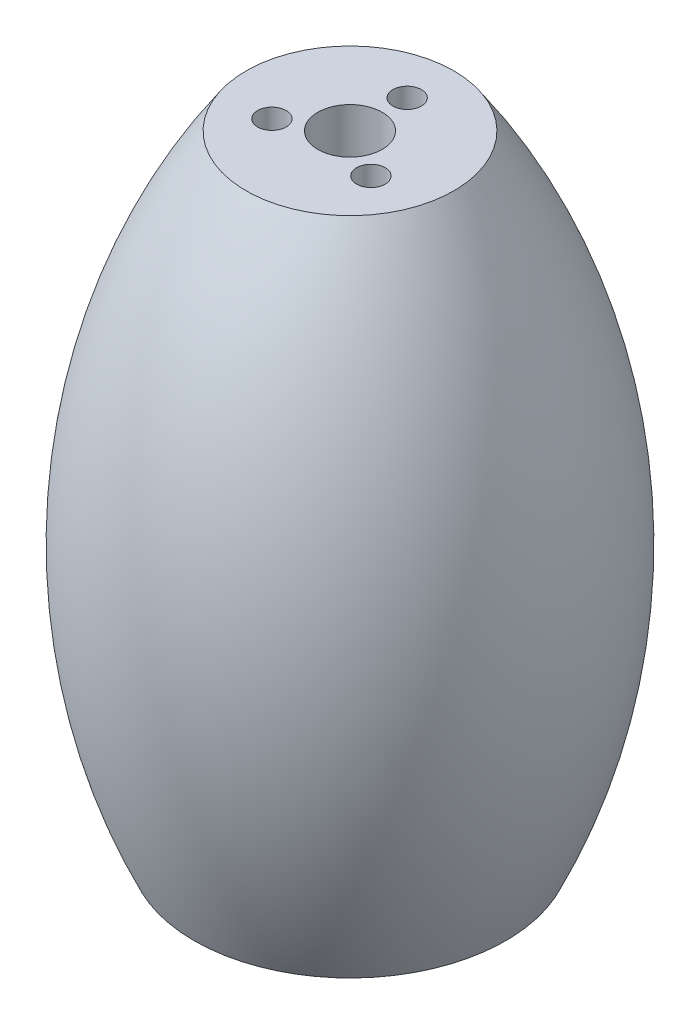
ISO-10303-21;
HEADER;
FILE_DESCRIPTION(('STEP AP214'),'2;1');
FILE_NAME('part.step','',(''),(''),'','','');
FILE_SCHEMA(('AUTOMOTIVE_DESIGN { 1 0 10303 214 1 1 1 1 }'));
ENDSEC;
DATA;
#1=APPLICATION_CONTEXT('core data for automotive mechanical design processes');
#2=APPLICATION_PROTOCOL_DEFINITION('international standard','automotive_design',2000,#1);
#3=PRODUCT_CONTEXT('',#1,'mechanical');
#4=PRODUCT('Part','Part','',(#3));
#5=PRODUCT_RELATED_PRODUCT_CATEGORY('part','',(#4));
#6=PRODUCT_DEFINITION_FORMATION('','',#4);
#7=PRODUCT_DEFINITION_CONTEXT('part definition',#1,'design');
#8=PRODUCT_DEFINITION('design','',#6,#7);
#9=PRODUCT_DEFINITION_SHAPE('','',#8);
#10=(LENGTH_UNIT() NAMED_UNIT(*) SI_UNIT(.MILLI.,.METRE.));
#11=(NAMED_UNIT(*) PLANE_ANGLE_UNIT() SI_UNIT($,.RADIAN.));
#12=(NAMED_UNIT(*) SI_UNIT($,.STERADIAN.) SOLID_ANGLE_UNIT());
#13=UNCERTAINTY_MEASURE_WITH_UNIT(LENGTH_MEASURE(1.E-05),#10,'distance_accuracy_value','');
#14=(GEOMETRIC_REPRESENTATION_CONTEXT(3) GLOBAL_UNCERTAINTY_ASSIGNED_CONTEXT((#13)) GLOBAL_UNIT_ASSIGNED_CONTEXT((#10,
#11,#12)) REPRESENTATION_CONTEXT('',''));
#15=CARTESIAN_POINT('',(0.,0.,0.));
#16=DIRECTION('',(0.,0.,1.));
#17=DIRECTION('',(1.,0.,0.));
#18=AXIS2_PLACEMENT_3D('',#15,#16,#17);
#19=CARTESIAN_POINT('',(0.,51.25,0.));
#20=DIRECTION('',(0.,-1.,0.));
#21=DIRECTION('',(0.,0.,-1.));
#22=AXIS2_PLACEMENT_3D('',#19,#20,#21);
#23=DEGENERATE_TOROIDAL_SURFACE('',#22,80.,121.353048993422,.F.);
#24=CARTESIAN_POINT('',(0.,0.,0.));
#25=DIRECTION('',(0.,-1.,0.));
#26=DIRECTION('',(0.,0.,-1.));
#27=AXIS2_PLACEMENT_3D('',#24,#25,#26);
#28=CIRCLE('',#27,30.);
#29=CARTESIAN_POINT('',(0.,0.,-30.));
#30=VERTEX_POINT('',#29);
#31=EDGE_CURVE('E44',#30,#30,#28,.T.);
#32=ORIENTED_EDGE('',*,*,#31,.F.);
#33=EDGE_LOOP('',(#32));
#34=FACE_BOUND('',#33,.T.);
#35=CARTESIAN_POINT('',(0.,120.,0.));
#36=DIRECTION('',(0.,-1.,0.));
#37=DIRECTION('',(0.,0.,-1.));
#38=AXIS2_PLACEMENT_3D('',#35,#36,#37);
#39=CIRCLE('',#38,20.);
#40=CARTESIAN_POINT('',(0.,120.,-20.));
#41=VERTEX_POINT('',#40);
#42=EDGE_CURVE('E10',#41,#41,#39,.T.);
#43=ORIENTED_EDGE('',*,*,#42,.T.);
#44=EDGE_LOOP('',(#43));
#45=FACE_BOUND('',#44,.T.);
#46=ADVANCED_FACE('F37',(#34,#45),#23,.F.);
#47=CARTESIAN_POINT('',(0.,120.,0.));
#48=DIRECTION('',(0.,-1.,0.));
#49=DIRECTION('',(0.,0.,-1.));
#50=AXIS2_PLACEMENT_3D('',#47,#48,#49);
#51=PLANE('',#50);
#52=CARTESIAN_POINT('',(0.,120.,0.));
#53=DIRECTION('',(0.,1.,0.));
#54=DIRECTION('',(0.,0.,1.));
#55=AXIS2_PLACEMENT_3D('',#52,#53,#54);
#56=CIRCLE('',#55,6.2);
#57=CARTESIAN_POINT('',(0.,120.,6.2));
#58=VERTEX_POINT('',#57);
#59=EDGE_CURVE('E101',#58,#58,#56,.T.);
#60=ORIENTED_EDGE('',*,*,#59,.F.);
#61=EDGE_LOOP('',(#60));
#62=FACE_BOUND('',#61,.T.);
#63=CARTESIAN_POINT('',(0.,120.,-11.));
#64=DIRECTION('',(0.,1.,0.));
#65=DIRECTION('',(0.,0.,1.));
#66=AXIS2_PLACEMENT_3D('',#63,#64,#65);
#67=CIRCLE('',#66,2.75);
#68=CARTESIAN_POINT('',(0.,120.,-8.25));
#69=VERTEX_POINT('',#68);
#70=EDGE_CURVE('E54',#69,#69,#67,.T.);
#71=ORIENTED_EDGE('',*,*,#70,.F.);
#72=EDGE_LOOP('',(#71));
#73=FACE_BOUND('',#72,.T.);
#74=CARTESIAN_POINT('',(9.52627944162882,120.,5.5));
#75=DIRECTION('',(0.,1.,0.));
#76=DIRECTION('',(0.,0.,1.));
#77=AXIS2_PLACEMENT_3D('',#74,#75,#76);
#78=CIRCLE('',#77,2.75000000000005);
#79=CARTESIAN_POINT('',(9.52627944162882,120.,8.25000000000005));
#80=VERTEX_POINT('',#79);
#81=EDGE_CURVE('E66',#80,#80,#78,.T.);
#82=ORIENTED_EDGE('',*,*,#81,.F.);
#83=EDGE_LOOP('',(#82));
#84=FACE_BOUND('',#83,.T.);
#85=CARTESIAN_POINT('',(-9.52627944162883,120.,5.5));
#86=DIRECTION('',(0.,1.,0.));
#87=DIRECTION('',(0.,0.,1.));
#88=AXIS2_PLACEMENT_3D('',#85,#86,#87);
#89=CIRCLE('',#88,2.7500000000001);
#90=CARTESIAN_POINT('',(-9.52627944162883,120.,8.2500000000001));
#91=VERTEX_POINT('',#90);
#92=EDGE_CURVE('E57',#91,#91,#89,.T.);
#93=ORIENTED_EDGE('',*,*,#92,.F.);
#94=EDGE_LOOP('',(#93));
#95=FACE_BOUND('',#94,.T.);
#96=ORIENTED_EDGE('',*,*,#42,.F.);
#97=EDGE_LOOP('',(#96));
#98=FACE_BOUND('',#97,.T.);
#99=ADVANCED_FACE('F119',(#62,#73,#84,#95,#98),#51,.F.);
#100=CARTESIAN_POINT('',(-30.,0.,0.));
#101=DIRECTION('',(0.,1.,0.));
#102=DIRECTION('',(0.,0.,1.));
#103=AXIS2_PLACEMENT_3D('',#100,#101,#102);
#104=PLANE('',#103);
#105=CARTESIAN_POINT('',(0.,0.,0.));
#106=DIRECTION('',(0.,1.,0.));
#107=DIRECTION('',(0.,0.,1.));
#108=AXIS2_PLACEMENT_3D('',#105,#106,#107);
#109=CIRCLE('',#108,6.2);
#110=CARTESIAN_POINT('',(0.,0.,6.2));
#111=VERTEX_POINT('',#110);
#112=EDGE_CURVE('E82',#111,#111,#109,.T.);
#113=ORIENTED_EDGE('',*,*,#112,.T.);
#114=EDGE_LOOP('',(#113));
#115=FACE_BOUND('',#114,.T.);
#116=CARTESIAN_POINT('',(0.,0.,-11.));
#117=DIRECTION('',(0.,1.,0.));
#118=DIRECTION('',(0.,0.,1.));
#119=AXIS2_PLACEMENT_3D('',#116,#117,#118);
#120=CIRCLE('',#119,2.75);
#121=CARTESIAN_POINT('',(0.,0.,-8.25));
#122=VERTEX_POINT('',#121);
#123=EDGE_CURVE('E94',#122,#122,#120,.T.);
#124=ORIENTED_EDGE('',*,*,#123,.T.);
#125=EDGE_LOOP('',(#124));
#126=FACE_BOUND('',#125,.T.);
#127=CARTESIAN_POINT('',(9.52627944162882,0.,5.5));
#128=DIRECTION('',(0.,1.,0.));
#129=DIRECTION('',(0.,0.,1.));
#130=AXIS2_PLACEMENT_3D('',#127,#128,#129);
#131=CIRCLE('',#130,2.75000000000005);
#132=CARTESIAN_POINT('',(9.52627944162882,0.,8.25000000000005));
#133=VERTEX_POINT('',#132);
#134=EDGE_CURVE('E86',#133,#133,#131,.T.);
#135=ORIENTED_EDGE('',*,*,#134,.T.);
#136=EDGE_LOOP('',(#135));
#137=FACE_BOUND('',#136,.T.);
#138=CARTESIAN_POINT('',(-9.52627944162883,0.,5.5));
#139=DIRECTION('',(0.,1.,0.));
#140=DIRECTION('',(0.,0.,1.));
#141=AXIS2_PLACEMENT_3D('',#138,#139,#140);
#142=CIRCLE('',#141,2.7500000000001);
#143=CARTESIAN_POINT('',(-9.52627944162883,0.,8.2500000000001));
#144=VERTEX_POINT('',#143);
#145=EDGE_CURVE('E77',#144,#144,#142,.T.);
#146=ORIENTED_EDGE('',*,*,#145,.T.);
#147=EDGE_LOOP('',(#146));
#148=FACE_BOUND('',#147,.T.);
#149=ORIENTED_EDGE('',*,*,#31,.T.);
#150=EDGE_LOOP('',(#149));
#151=FACE_BOUND('',#150,.T.);
#152=ADVANCED_FACE('F109',(#115,#126,#137,#148,#151),#104,.F.);
#153=CARTESIAN_POINT('',(-9.52627944162883,115.,5.5));
#154=DIRECTION('',(0.,1.,0.));
#155=DIRECTION('',(0.,0.,1.));
#156=AXIS2_PLACEMENT_3D('',#153,#154,#155);
#157=CYLINDRICAL_SURFACE('',#156,2.7500000000001);
#158=CARTESIAN_POINT('',(-9.52627944162883,115.,5.5));
#159=DIRECTION('',(0.,1.,0.));
#160=DIRECTION('',(0.,0.,1.));
#161=AXIS2_PLACEMENT_3D('',#158,#159,#160);
#162=CIRCLE('',#161,2.7500000000001);
#163=CARTESIAN_POINT('',(-9.52627944162883,115.,8.2500000000001));
#164=VERTEX_POINT('',#163);
#165=EDGE_CURVE('E61',#164,#164,#162,.T.);
#166=ORIENTED_EDGE('',*,*,#165,.F.);
#167=EDGE_LOOP('',(#166));
#168=FACE_BOUND('',#167,.T.);
#169=ORIENTED_EDGE('',*,*,#92,.T.);
#170=EDGE_LOOP('',(#169));
#171=FACE_BOUND('',#170,.T.);
#172=ADVANCED_FACE('F129',(#168,#171),#157,.F.);
#173=CARTESIAN_POINT('',(-9.52627944162883,115.,5.5));
#174=DIRECTION('',(0.,1.,0.));
#175=DIRECTION('',(0.,0.,1.));
#176=AXIS2_PLACEMENT_3D('',#173,#174,#175);
#177=PLANE('',#176);
#178=ORIENTED_EDGE('',*,*,#165,.T.);
#179=EDGE_LOOP('',(#178));
#180=FACE_BOUND('',#179,.T.);
#181=ADVANCED_FACE('F131',(#180),#177,.T.);
#182=CARTESIAN_POINT('',(9.52627944162882,115.,5.5));
#183=DIRECTION('',(0.,1.,0.));
#184=DIRECTION('',(0.,0.,1.));
#185=AXIS2_PLACEMENT_3D('',#182,#183,#184);
#186=CYLINDRICAL_SURFACE('',#185,2.75000000000005);
#187=CARTESIAN_POINT('',(9.52627944162882,115.,5.5));
#188=DIRECTION('',(0.,1.,0.));
#189=DIRECTION('',(0.,0.,1.));
#190=AXIS2_PLACEMENT_3D('',#187,#188,#189);
#191=CIRCLE('',#190,2.75000000000005);
#192=CARTESIAN_POINT('',(9.52627944162882,115.,8.25000000000005));
#193=VERTEX_POINT('',#192);
#194=EDGE_CURVE('E70',#193,#193,#191,.T.);
#195=ORIENTED_EDGE('',*,*,#194,.F.);
#196=EDGE_LOOP('',(#195));
#197=FACE_BOUND('',#196,.T.);
#198=ORIENTED_EDGE('',*,*,#81,.T.);
#199=EDGE_LOOP('',(#198));
#200=FACE_BOUND('',#199,.T.);
#201=ADVANCED_FACE('F138',(#197,#200),#186,.F.);
#202=CARTESIAN_POINT('',(9.52627944162882,115.,5.5));
#203=DIRECTION('',(0.,1.,0.));
#204=DIRECTION('',(0.,0.,1.));
#205=AXIS2_PLACEMENT_3D('',#202,#203,#204);
#206=PLANE('',#205);
#207=ORIENTED_EDGE('',*,*,#194,.T.);
#208=EDGE_LOOP('',(#207));
#209=FACE_BOUND('',#208,.T.);
#210=ADVANCED_FACE('F226',(#209),#206,.T.);
#211=CARTESIAN_POINT('',(0.,115.,-11.));
#212=DIRECTION('',(0.,1.,0.));
#213=DIRECTION('',(0.,0.,1.));
#214=AXIS2_PLACEMENT_3D('',#211,#212,#213);
#215=CYLINDRICAL_SURFACE('',#214,2.75);
#216=CARTESIAN_POINT('',(0.,115.,-11.));
#217=DIRECTION('',(0.,1.,0.));
#218=DIRECTION('',(0.,0.,1.));
#219=AXIS2_PLACEMENT_3D('',#216,#217,#218);
#220=CIRCLE('',#219,2.75);
#221=CARTESIAN_POINT('',(0.,115.,-8.25));
#222=VERTEX_POINT('',#221);
#223=EDGE_CURVE('E49',#222,#222,#220,.T.);
#224=ORIENTED_EDGE('',*,*,#223,.F.);
#225=EDGE_LOOP('',(#224));
#226=FACE_BOUND('',#225,.T.);
#227=ORIENTED_EDGE('',*,*,#70,.T.);
#228=EDGE_LOOP('',(#227));
#229=FACE_BOUND('',#228,.T.);
#230=ADVANCED_FACE('F218',(#226,#229),#215,.F.);
#231=CARTESIAN_POINT('',(0.,115.,-11.));
#232=DIRECTION('',(0.,1.,0.));
#233=DIRECTION('',(0.,0.,1.));
#234=AXIS2_PLACEMENT_3D('',#231,#232,#233);
#235=PLANE('',#234);
#236=ORIENTED_EDGE('',*,*,#223,.T.);
#237=EDGE_LOOP('',(#236));
#238=FACE_BOUND('',#237,.T.);
#239=ADVANCED_FACE('F210',(#238),#235,.T.);
#240=CARTESIAN_POINT('',(-9.52627944162883,5.,5.5));
#241=DIRECTION('',(0.,-1.,0.));
#242=DIRECTION('',(0.,0.,-1.));
#243=AXIS2_PLACEMENT_3D('',#240,#241,#242);
#244=CYLINDRICAL_SURFACE('',#243,2.7500000000001);
#245=CARTESIAN_POINT('',(-9.52627944162883,5.,5.5));
#246=DIRECTION('',(0.,1.,0.));
#247=DIRECTION('',(0.,0.,1.));
#248=AXIS2_PLACEMENT_3D('',#245,#246,#247);
#249=CIRCLE('',#248,2.7500000000001);
#250=CARTESIAN_POINT('',(-9.52627944162883,5.,8.2500000000001));
#251=VERTEX_POINT('',#250);
#252=EDGE_CURVE('E81',#251,#251,#249,.T.);
#253=ORIENTED_EDGE('',*,*,#252,.T.);
#254=EDGE_LOOP('',(#253));
#255=FACE_BOUND('',#254,.T.);
#256=ORIENTED_EDGE('',*,*,#145,.F.);
#257=EDGE_LOOP('',(#256));
#258=FACE_BOUND('',#257,.T.);
#259=ADVANCED_FACE('F202',(#255,#258),#244,.F.);
#260=CARTESIAN_POINT('',(-9.52627944162883,5.,5.5));
#261=DIRECTION('',(0.,-1.,0.));
#262=DIRECTION('',(0.,0.,1.));
#263=AXIS2_PLACEMENT_3D('',#260,#261,#262);
#264=PLANE('',#263);
#265=ORIENTED_EDGE('',*,*,#252,.F.);
#266=EDGE_LOOP('',(#265));
#267=FACE_BOUND('',#266,.T.);
#268=ADVANCED_FACE('F194',(#267),#264,.T.);
#269=CARTESIAN_POINT('',(9.52627944162882,5.,5.5));
#270=DIRECTION('',(0.,-1.,0.));
#271=DIRECTION('',(0.,0.,-1.));
#272=AXIS2_PLACEMENT_3D('',#269,#270,#271);
#273=CYLINDRICAL_SURFACE('',#272,2.75000000000005);
#274=CARTESIAN_POINT('',(9.52627944162882,5.,5.5));
#275=DIRECTION('',(0.,1.,0.));
#276=DIRECTION('',(0.,0.,1.));
#277=AXIS2_PLACEMENT_3D('',#274,#275,#276);
#278=CIRCLE('',#277,2.75000000000005);
#279=CARTESIAN_POINT('',(9.52627944162882,5.,8.25000000000005));
#280=VERTEX_POINT('',#279);
#281=EDGE_CURVE('E90',#280,#280,#278,.T.);
#282=ORIENTED_EDGE('',*,*,#281,.T.);
#283=EDGE_LOOP('',(#282));
#284=FACE_BOUND('',#283,.T.);
#285=ORIENTED_EDGE('',*,*,#134,.F.);
#286=EDGE_LOOP('',(#285));
#287=FACE_BOUND('',#286,.T.);
#288=ADVANCED_FACE('F186',(#284,#287),#273,.F.);
#289=CARTESIAN_POINT('',(9.52627944162882,5.,5.5));
#290=DIRECTION('',(0.,-1.,0.));
#291=DIRECTION('',(0.,0.,1.));
#292=AXIS2_PLACEMENT_3D('',#289,#290,#291);
#293=PLANE('',#292);
#294=ORIENTED_EDGE('',*,*,#281,.F.);
#295=EDGE_LOOP('',(#294));
#296=FACE_BOUND('',#295,.T.);
#297=ADVANCED_FACE('F178',(#296),#293,.T.);
#298=CARTESIAN_POINT('',(0.,5.,-11.));
#299=DIRECTION('',(0.,-1.,0.));
#300=DIRECTION('',(0.,0.,-1.));
#301=AXIS2_PLACEMENT_3D('',#298,#299,#300);
#302=CYLINDRICAL_SURFACE('',#301,2.75);
#303=CARTESIAN_POINT('',(0.,5.,-11.));
#304=DIRECTION('',(0.,1.,0.));
#305=DIRECTION('',(0.,0.,1.));
#306=AXIS2_PLACEMENT_3D('',#303,#304,#305);
#307=CIRCLE('',#306,2.75);
#308=CARTESIAN_POINT('',(0.,5.,-8.25));
#309=VERTEX_POINT('',#308);
#310=EDGE_CURVE('E62',#309,#309,#307,.T.);
#311=ORIENTED_EDGE('',*,*,#310,.T.);
#312=EDGE_LOOP('',(#311));
#313=FACE_BOUND('',#312,.T.);
#314=ORIENTED_EDGE('',*,*,#123,.F.);
#315=EDGE_LOOP('',(#314));
#316=FACE_BOUND('',#315,.T.);
#317=ADVANCED_FACE('F171',(#313,#316),#302,.F.);
#318=CARTESIAN_POINT('',(0.,5.,-11.));
#319=DIRECTION('',(0.,-1.,0.));
#320=DIRECTION('',(0.,0.,1.));
#321=AXIS2_PLACEMENT_3D('',#318,#319,#320);
#322=PLANE('',#321);
#323=ORIENTED_EDGE('',*,*,#310,.F.);
#324=EDGE_LOOP('',(#323));
#325=FACE_BOUND('',#324,.T.);
#326=ADVANCED_FACE('F115',(#325),#322,.T.);
#327=CARTESIAN_POINT('',(0.,0.,0.));
#328=DIRECTION('',(0.,1.,0.));
#329=DIRECTION('',(0.,0.,1.));
#330=AXIS2_PLACEMENT_3D('',#327,#328,#329);
#331=CYLINDRICAL_SURFACE('',#330,6.2);
#332=ORIENTED_EDGE('',*,*,#112,.F.);
#333=EDGE_LOOP('',(#332));
#334=FACE_BOUND('',#333,.T.);
#335=ORIENTED_EDGE('',*,*,#59,.T.);
#336=EDGE_LOOP('',(#335));
#337=FACE_BOUND('',#336,.T.);
#338=ADVANCED_FACE('F112',(#334,#337),#331,.F.);
#339=CLOSED_SHELL('',(#46,#99,#152,#172,#181,#201,#210,#230,#239,#259,#268,#288,#297,#317,#326,#338));
#340=MANIFOLD_SOLID_BREP('B2',#339);
#341=ADVANCED_BREP_SHAPE_REPRESENTATION('',(#18,#340),#14);
#342=SHAPE_DEFINITION_REPRESENTATION(#9,#341);
ENDSEC;
END-ISO-10303-21;
